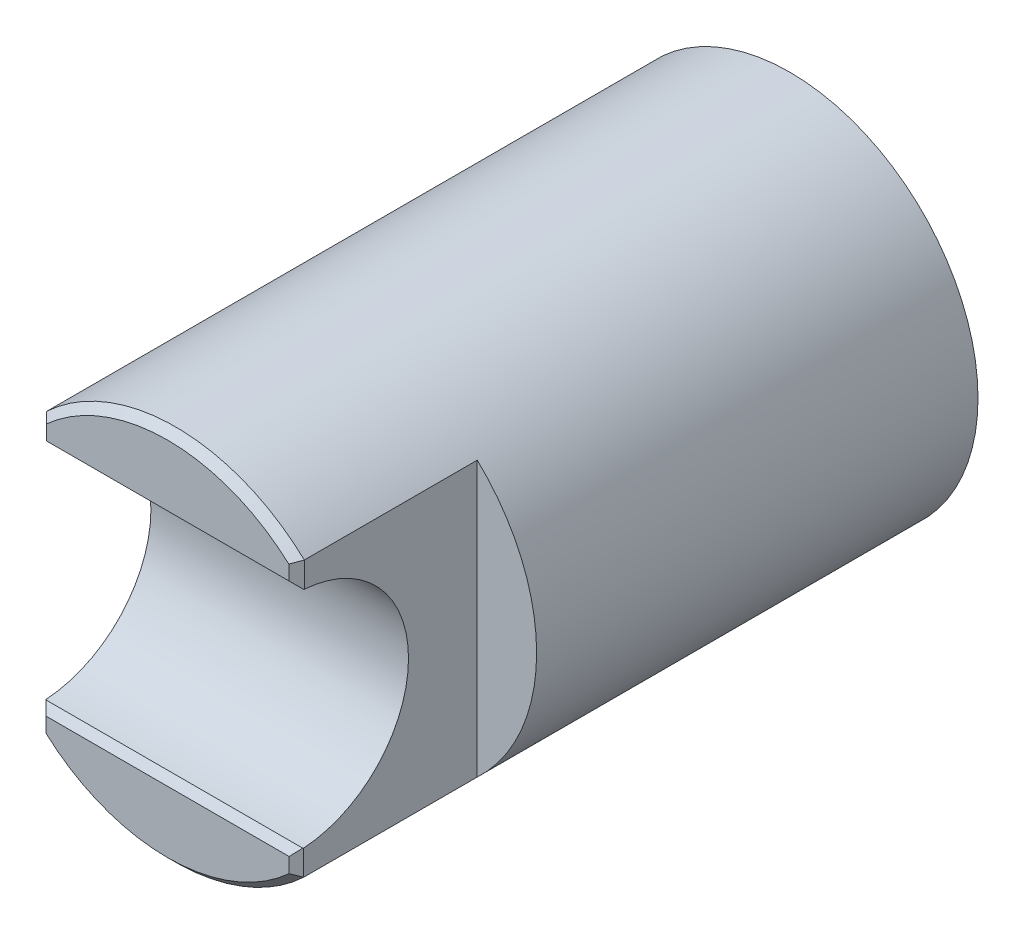
ISO-10303-21;
HEADER;
FILE_DESCRIPTION(('STEP AP214'),'2;1');
FILE_NAME('part.step','',(''),(''),'','','');
FILE_SCHEMA(('AUTOMOTIVE_DESIGN { 1 0 10303 214 1 1 1 1 }'));
ENDSEC;
DATA;
#1=APPLICATION_CONTEXT('core data for automotive mechanical design processes');
#2=APPLICATION_PROTOCOL_DEFINITION('international standard','automotive_design',2000,#1);
#3=PRODUCT_CONTEXT('',#1,'mechanical');
#4=PRODUCT('Part','Part','',(#3));
#5=PRODUCT_RELATED_PRODUCT_CATEGORY('part','',(#4));
#6=PRODUCT_DEFINITION_FORMATION('','',#4);
#7=PRODUCT_DEFINITION_CONTEXT('part definition',#1,'design');
#8=PRODUCT_DEFINITION('design','',#6,#7);
#9=PRODUCT_DEFINITION_SHAPE('','',#8);
#10=(LENGTH_UNIT() NAMED_UNIT(*) SI_UNIT(.MILLI.,.METRE.));
#11=(NAMED_UNIT(*) PLANE_ANGLE_UNIT() SI_UNIT($,.RADIAN.));
#12=(NAMED_UNIT(*) SI_UNIT($,.STERADIAN.) SOLID_ANGLE_UNIT());
#13=UNCERTAINTY_MEASURE_WITH_UNIT(LENGTH_MEASURE(1.E-05),#10,'distance_accuracy_value','');
#14=(GEOMETRIC_REPRESENTATION_CONTEXT(3) GLOBAL_UNCERTAINTY_ASSIGNED_CONTEXT((#13)) GLOBAL_UNIT_ASSIGNED_CONTEXT((#10,
#11,#12)) REPRESENTATION_CONTEXT('',''));
#15=CARTESIAN_POINT('',(0.,0.,0.));
#16=DIRECTION('',(0.,0.,1.));
#17=DIRECTION('',(1.,0.,0.));
#18=AXIS2_PLACEMENT_3D('',#15,#16,#17);
#19=CARTESIAN_POINT('',(0.,0.,-43.));
#20=DIRECTION('',(0.,0.,1.));
#21=DIRECTION('',(1.,0.,0.));
#22=AXIS2_PLACEMENT_3D('',#19,#20,#21);
#23=CYLINDRICAL_SURFACE('',#22,13.005);
#24=CARTESIAN_POINT('',(0.,0.,-43.));
#25=DIRECTION('',(0.,0.,1.));
#26=DIRECTION('',(1.,0.,0.));
#27=AXIS2_PLACEMENT_3D('',#24,#25,#26);
#28=CIRCLE('',#27,13.005);
#29=CARTESIAN_POINT('',(13.005,0.,-43.));
#30=VERTEX_POINT('',#29);
#31=EDGE_CURVE('E138',#30,#30,#28,.T.);
#32=ORIENTED_EDGE('',*,*,#31,.T.);
#33=EDGE_LOOP('',(#32));
#34=FACE_BOUND('',#33,.T.);
#35=DIRECTION('',(0.,0.,1.));
#36=VECTOR('',#35,1.);
#37=CARTESIAN_POINT('',(-8.9,9.48261699110536,-43.));
#38=LINE('',#37,#36);
#39=CARTESIAN_POINT('',(-8.9,9.48261699110536,-0.551886359212057));
#40=VERTEX_POINT('',#39);
#41=CARTESIAN_POINT('',(-8.9,9.48261699110536,-12.5));
#42=VERTEX_POINT('',#41);
#43=EDGE_CURVE('E166',#40,#42,#38,.F.);
#44=ORIENTED_EDGE('',*,*,#43,.F.);
#45=CARTESIAN_POINT('',(0.,0.,-0.551886359212057));
#46=DIRECTION('',(0.,0.,1.));
#47=DIRECTION('',(1.,0.,0.));
#48=AXIS2_PLACEMENT_3D('',#45,#46,#47);
#49=CIRCLE('',#48,13.005);
#50=CARTESIAN_POINT('',(8.9,9.48261699110536,-0.551886359212057));
#51=VERTEX_POINT('',#50);
#52=EDGE_CURVE('E201',#40,#51,#49,.F.);
#53=ORIENTED_EDGE('',*,*,#52,.T.);
#54=DIRECTION('',(0.,0.,1.));
#55=VECTOR('',#54,1.);
#56=CARTESIAN_POINT('',(8.9,9.48261699110536,-43.));
#57=LINE('',#56,#55);
#58=CARTESIAN_POINT('',(8.9,9.48261699110536,-12.5));
#59=VERTEX_POINT('',#58);
#60=EDGE_CURVE('E139',#59,#51,#57,.T.);
#61=ORIENTED_EDGE('',*,*,#60,.F.);
#62=CARTESIAN_POINT('',(0.,0.,-12.5));
#63=DIRECTION('',(0.,0.,1.));
#64=DIRECTION('',(1.,0.,0.));
#65=AXIS2_PLACEMENT_3D('',#62,#63,#64);
#66=CIRCLE('',#65,13.005);
#67=CARTESIAN_POINT('',(8.9,-9.48261699110536,-12.5));
#68=VERTEX_POINT('',#67);
#69=EDGE_CURVE('E134',#68,#59,#66,.T.);
#70=ORIENTED_EDGE('',*,*,#69,.F.);
#71=DIRECTION('',(0.,0.,1.));
#72=VECTOR('',#71,1.);
#73=CARTESIAN_POINT('',(8.9,-9.48261699110536,-43.));
#74=LINE('',#73,#72);
#75=CARTESIAN_POINT('',(8.9,-9.48261699110536,-0.500000000000007));
#76=VERTEX_POINT('',#75);
#77=EDGE_CURVE('E142',#68,#76,#74,.T.);
#78=ORIENTED_EDGE('',*,*,#77,.T.);
#79=CARTESIAN_POINT('',(0.,0.,-0.500000000000007));
#80=DIRECTION('',(0.,0.,1.));
#81=DIRECTION('',(1.,0.,0.));
#82=AXIS2_PLACEMENT_3D('',#79,#80,#81);
#83=CIRCLE('',#82,13.005);
#84=CARTESIAN_POINT('',(-8.9,-9.48261699110536,-0.500000000000007));
#85=VERTEX_POINT('',#84);
#86=EDGE_CURVE('E199',#76,#85,#83,.F.);
#87=ORIENTED_EDGE('',*,*,#86,.T.);
#88=DIRECTION('',(0.,0.,1.));
#89=VECTOR('',#88,1.);
#90=CARTESIAN_POINT('',(-8.9,-9.48261699110536,-43.));
#91=LINE('',#90,#89);
#92=CARTESIAN_POINT('',(-8.9,-9.48261699110536,-12.5));
#93=VERTEX_POINT('',#92);
#94=EDGE_CURVE('E157',#85,#93,#91,.F.);
#95=ORIENTED_EDGE('',*,*,#94,.T.);
#96=CARTESIAN_POINT('',(0.,0.,-12.5));
#97=DIRECTION('',(0.,0.,1.));
#98=DIRECTION('',(1.,0.,0.));
#99=AXIS2_PLACEMENT_3D('',#96,#97,#98);
#100=CIRCLE('',#99,13.005);
#101=EDGE_CURVE('E163',#42,#93,#100,.T.);
#102=ORIENTED_EDGE('',*,*,#101,.F.);
#103=EDGE_LOOP('',(#44,#53,#61,#70,#78,#87,#95,#102));
#104=FACE_BOUND('',#103,.T.);
#105=ADVANCED_FACE('F35',(#34,#104),#23,.T.);
#106=CARTESIAN_POINT('',(0.,0.,0.));
#107=DIRECTION('',(0.,0.,1.));
#108=DIRECTION('',(1.,0.,0.));
#109=AXIS2_PLACEMENT_3D('',#106,#107,#108);
#110=PLANE('',#109);
#111=CARTESIAN_POINT('',(0.,0.,0.));
#112=DIRECTION('',(0.,0.,1.));
#113=DIRECTION('',(1.,0.,0.));
#114=AXIS2_PLACEMENT_3D('',#111,#112,#113);
#115=CIRCLE('',#114,12.486561298922);
#116=CARTESIAN_POINT('',(8.381561298922,9.25546558872916,0.));
#117=VERTEX_POINT('',#116);
#118=CARTESIAN_POINT('',(-8.381561298922,9.25546558872916,0.));
#119=VERTEX_POINT('',#118);
#120=EDGE_CURVE('E176',#117,#119,#115,.T.);
#121=ORIENTED_EDGE('',*,*,#120,.T.);
#122=DIRECTION('',(0.,-1.,0.));
#123=VECTOR('',#122,1.);
#124=CARTESIAN_POINT('',(-8.381561298922,0.,0.));
#125=LINE('',#124,#123);
#126=CARTESIAN_POINT('',(-8.381561298922,8.25,0.));
#127=VERTEX_POINT('',#126);
#128=EDGE_CURVE('E178',#119,#127,#125,.T.);
#129=ORIENTED_EDGE('',*,*,#128,.T.);
#130=DIRECTION('',(1.,0.,0.));
#131=VECTOR('',#130,1.);
#132=CARTESIAN_POINT('',(0.,8.25,0.));
#133=LINE('',#132,#131);
#134=CARTESIAN_POINT('',(8.381561298922,8.25,0.));
#135=VERTEX_POINT('',#134);
#136=EDGE_CURVE('E172',#127,#135,#133,.T.);
#137=ORIENTED_EDGE('',*,*,#136,.T.);
#138=DIRECTION('',(0.,1.,0.));
#139=VECTOR('',#138,1.);
#140=CARTESIAN_POINT('',(8.381561298922,0.,0.));
#141=LINE('',#140,#139);
#142=EDGE_CURVE('E174',#135,#117,#141,.T.);
#143=ORIENTED_EDGE('',*,*,#142,.T.);
#144=EDGE_LOOP('',(#121,#129,#137,#143));
#145=FACE_BOUND('',#144,.T.);
#146=ADVANCED_FACE('F286',(#145),#110,.T.);
#147=DIRECTION('',(-1.,0.,0.));
#148=VECTOR('',#147,1.);
#149=CARTESIAN_POINT('',(0.,-8.23483454600031,0.));
#150=LINE('',#149,#148);
#151=CARTESIAN_POINT('',(8.4,-8.23483454600031,0.));
#152=VERTEX_POINT('',#151);
#153=CARTESIAN_POINT('',(-8.4,-8.23483454600031,0.));
#154=VERTEX_POINT('',#153);
#155=EDGE_CURVE('E51',#152,#154,#150,.T.);
#156=ORIENTED_EDGE('',*,*,#155,.T.);
#157=DIRECTION('',(0.,-1.,0.));
#158=VECTOR('',#157,1.);
#159=CARTESIAN_POINT('',(-8.4,0.,0.));
#160=LINE('',#159,#158);
#161=CARTESIAN_POINT('',(-8.4,-9.2636399433484,0.));
#162=VERTEX_POINT('',#161);
#163=EDGE_CURVE('E11',#154,#162,#160,.T.);
#164=ORIENTED_EDGE('',*,*,#163,.T.);
#165=CARTESIAN_POINT('',(0.,0.,0.));
#166=DIRECTION('',(0.,0.,1.));
#167=DIRECTION('',(1.,0.,0.));
#168=AXIS2_PLACEMENT_3D('',#165,#166,#167);
#169=CIRCLE('',#168,12.505);
#170=CARTESIAN_POINT('',(8.4,-9.2636399433484,0.));
#171=VERTEX_POINT('',#170);
#172=EDGE_CURVE('E206',#162,#171,#169,.T.);
#173=ORIENTED_EDGE('',*,*,#172,.T.);
#174=DIRECTION('',(0.,1.,0.));
#175=VECTOR('',#174,1.);
#176=CARTESIAN_POINT('',(8.4,0.,0.));
#177=LINE('',#176,#175);
#178=EDGE_CURVE('E62',#171,#152,#177,.T.);
#179=ORIENTED_EDGE('',*,*,#178,.T.);
#180=EDGE_LOOP('',(#156,#164,#173,#179));
#181=FACE_BOUND('',#180,.T.);
#182=ADVANCED_FACE('F291',(#181),#110,.T.);
#183=CARTESIAN_POINT('',(13.006,0.,0.));
#184=DIRECTION('',(-1.,0.,0.));
#185=DIRECTION('',(0.,0.,1.));
#186=AXIS2_PLACEMENT_3D('',#183,#184,#185);
#187=CYLINDRICAL_SURFACE('',#186,7.75);
#188=DIRECTION('',(-1.,0.,0.));
#189=VECTOR('',#188,1.);
#190=CARTESIAN_POINT('',(13.006,7.73271742241545,-0.517282577584549));
#191=LINE('',#190,#189);
#192=CARTESIAN_POINT('',(8.867493417259,7.73271742241545,-0.517282577584549));
#193=VERTEX_POINT('',#192);
#194=CARTESIAN_POINT('',(-8.86749341725901,7.73271742241545,-0.517282577584549));
#195=VERTEX_POINT('',#194);
#196=EDGE_CURVE('E187',#193,#195,#191,.T.);
#197=ORIENTED_EDGE('',*,*,#196,.T.);
#198=CARTESIAN_POINT('',(-8.381561298922,0.,0.));
#199=DIRECTION('',(0.728848072093986,0.,-0.684675461664049));
#200=DIRECTION('',(-0.684675461664049,0.,-0.728848072093986));
#201=AXIS2_PLACEMENT_3D('',#198,#199,#200);
#202=ELLIPSE('',#201,10.6332173970553,7.75);
#203=CARTESIAN_POINT('',(-8.9,7.73032479566775,-0.55188635921206));
#204=VERTEX_POINT('',#203);
#205=EDGE_CURVE('E191',#195,#204,#202,.F.);
#206=ORIENTED_EDGE('',*,*,#205,.T.);
#207=CARTESIAN_POINT('',(-8.9,0.,0.));
#208=DIRECTION('',(-1.,0.,0.));
#209=DIRECTION('',(0.,0.,1.));
#210=AXIS2_PLACEMENT_3D('',#207,#208,#209);
#211=CIRCLE('',#210,7.75);
#212=CARTESIAN_POINT('',(-8.9,-7.73385414912901,-0.500000000000009));
#213=VERTEX_POINT('',#212);
#214=EDGE_CURVE('E159',#213,#204,#211,.F.);
#215=ORIENTED_EDGE('',*,*,#214,.F.);
#216=CARTESIAN_POINT('',(-8.4,0.,0.));
#217=DIRECTION('',(0.70710678118655,0.,-0.707106781186545));
#218=DIRECTION('',(-0.707106781186545,0.,-0.70710678118655));
#219=AXIS2_PLACEMENT_3D('',#216,#217,#218);
#220=ELLIPSE('',#219,10.9601551083914,7.75);
#221=CARTESIAN_POINT('',(-8.86969696969697,-7.73575366442453,-0.469696969696978));
#222=VERTEX_POINT('',#221);
#223=EDGE_CURVE('E185',#213,#222,#220,.F.);
#224=ORIENTED_EDGE('',*,*,#223,.T.);
#225=DIRECTION('',(-1.,0.,0.));
#226=VECTOR('',#225,1.);
#227=CARTESIAN_POINT('',(13.006,-7.73575366442453,-0.469696969696978));
#228=LINE('',#227,#226);
#229=CARTESIAN_POINT('',(8.86969696969697,-7.73575366442453,-0.469696969696978));
#230=VERTEX_POINT('',#229);
#231=EDGE_CURVE('E183',#222,#230,#228,.F.);
#232=ORIENTED_EDGE('',*,*,#231,.T.);
#233=CARTESIAN_POINT('',(8.4,0.,0.));
#234=DIRECTION('',(-0.70710678118655,0.,-0.707106781186545));
#235=DIRECTION('',(-0.707106781186545,0.,0.70710678118655));
#236=AXIS2_PLACEMENT_3D('',#233,#234,#235);
#237=ELLIPSE('',#236,10.9601551083914,7.75);
#238=CARTESIAN_POINT('',(8.9,-7.73385414912901,-0.500000000000009));
#239=VERTEX_POINT('',#238);
#240=EDGE_CURVE('E181',#230,#239,#237,.F.);
#241=ORIENTED_EDGE('',*,*,#240,.T.);
#242=CARTESIAN_POINT('',(8.9,0.,0.));
#243=DIRECTION('',(1.,0.,0.));
#244=DIRECTION('',(0.,0.,-1.));
#245=AXIS2_PLACEMENT_3D('',#242,#243,#244);
#246=CIRCLE('',#245,7.75);
#247=CARTESIAN_POINT('',(8.9,7.73032479566775,-0.55188635921206));
#248=VERTEX_POINT('',#247);
#249=EDGE_CURVE('E149',#248,#239,#246,.F.);
#250=ORIENTED_EDGE('',*,*,#249,.F.);
#251=CARTESIAN_POINT('',(8.381561298922,0.,0.));
#252=DIRECTION('',(-0.728848072093986,0.,-0.684675461664049));
#253=DIRECTION('',(-0.684675461664049,0.,0.728848072093986));
#254=AXIS2_PLACEMENT_3D('',#251,#252,#253);
#255=ELLIPSE('',#254,10.6332173970553,7.75);
#256=EDGE_CURVE('E189',#248,#193,#255,.F.);
#257=ORIENTED_EDGE('',*,*,#256,.T.);
#258=EDGE_LOOP('',(#197,#206,#215,#224,#232,#241,#250,#257));
#259=FACE_BOUND('',#258,.T.);
#260=ADVANCED_FACE('F299',(#259),#187,.F.);
#261=CARTESIAN_POINT('',(0.,0.,-43.));
#262=DIRECTION('',(0.,0.,1.));
#263=DIRECTION('',(1.,0.,0.));
#264=AXIS2_PLACEMENT_3D('',#261,#262,#263);
#265=PLANE('',#264);
#266=ORIENTED_EDGE('',*,*,#31,.F.);
#267=EDGE_LOOP('',(#266));
#268=FACE_BOUND('',#267,.T.);
#269=ADVANCED_FACE('F295',(#268),#265,.F.);
#270=CARTESIAN_POINT('',(-8.9,13.006,-12.5));
#271=DIRECTION('',(0.,0.,1.));
#272=DIRECTION('',(1.,0.,0.));
#273=AXIS2_PLACEMENT_3D('',#270,#271,#272);
#274=PLANE('',#273);
#275=ORIENTED_EDGE('',*,*,#101,.T.);
#276=DIRECTION('',(0.,-1.,0.));
#277=VECTOR('',#276,1.);
#278=CARTESIAN_POINT('',(-8.9,13.006,-12.5));
#279=LINE('',#278,#277);
#280=EDGE_CURVE('E150',#42,#93,#279,.T.);
#281=ORIENTED_EDGE('',*,*,#280,.F.);
#282=EDGE_LOOP('',(#275,#281));
#283=FACE_BOUND('',#282,.T.);
#284=ADVANCED_FACE('F298',(#283),#274,.T.);
#285=CARTESIAN_POINT('',(-8.9,13.006,0.));
#286=DIRECTION('',(-1.,0.,0.));
#287=DIRECTION('',(0.,0.,1.));
#288=AXIS2_PLACEMENT_3D('',#285,#286,#287);
#289=PLANE('',#288);
#290=ORIENTED_EDGE('',*,*,#214,.T.);
#291=DIRECTION('',(0.,1.,0.));
#292=VECTOR('',#291,1.);
#293=CARTESIAN_POINT('',(-8.9,13.006,-0.55188635921206));
#294=LINE('',#293,#292);
#295=EDGE_CURVE('E196',#204,#40,#294,.T.);
#296=ORIENTED_EDGE('',*,*,#295,.T.);
#297=ORIENTED_EDGE('',*,*,#43,.T.);
#298=ORIENTED_EDGE('',*,*,#280,.T.);
#299=ORIENTED_EDGE('',*,*,#94,.F.);
#300=DIRECTION('',(0.,1.,0.));
#301=VECTOR('',#300,1.);
#302=CARTESIAN_POINT('',(-8.9,13.006,-0.500000000000009));
#303=LINE('',#302,#301);
#304=EDGE_CURVE('E193',#85,#213,#303,.T.);
#305=ORIENTED_EDGE('',*,*,#304,.T.);
#306=EDGE_LOOP('',(#290,#296,#297,#298,#299,#305));
#307=FACE_BOUND('',#306,.T.);
#308=ADVANCED_FACE('F304',(#307),#289,.T.);
#309=CARTESIAN_POINT('',(8.9,13.006,-12.5));
#310=DIRECTION('',(0.,0.,1.));
#311=DIRECTION('',(1.,0.,0.));
#312=AXIS2_PLACEMENT_3D('',#309,#310,#311);
#313=PLANE('',#312);
#314=ORIENTED_EDGE('',*,*,#69,.T.);
#315=DIRECTION('',(0.,-1.,0.));
#316=VECTOR('',#315,1.);
#317=CARTESIAN_POINT('',(8.9,13.006,-12.5));
#318=LINE('',#317,#316);
#319=EDGE_CURVE('E130',#59,#68,#318,.T.);
#320=ORIENTED_EDGE('',*,*,#319,.T.);
#321=EDGE_LOOP('',(#314,#320));
#322=FACE_BOUND('',#321,.T.);
#323=ADVANCED_FACE('F132',(#322),#313,.T.);
#324=CARTESIAN_POINT('',(8.9,13.006,0.));
#325=DIRECTION('',(1.,0.,0.));
#326=DIRECTION('',(0.,0.,-1.));
#327=AXIS2_PLACEMENT_3D('',#324,#325,#326);
#328=PLANE('',#327);
#329=ORIENTED_EDGE('',*,*,#60,.T.);
#330=DIRECTION('',(0.,-1.,0.));
#331=VECTOR('',#330,1.);
#332=CARTESIAN_POINT('',(8.9,13.006,-0.55188635921206));
#333=LINE('',#332,#331);
#334=EDGE_CURVE('E204',#51,#248,#333,.T.);
#335=ORIENTED_EDGE('',*,*,#334,.T.);
#336=ORIENTED_EDGE('',*,*,#249,.T.);
#337=DIRECTION('',(0.,-1.,0.));
#338=VECTOR('',#337,1.);
#339=CARTESIAN_POINT('',(8.9,13.006,-0.500000000000009));
#340=LINE('',#339,#338);
#341=EDGE_CURVE('E146',#239,#76,#340,.T.);
#342=ORIENTED_EDGE('',*,*,#341,.T.);
#343=ORIENTED_EDGE('',*,*,#77,.F.);
#344=ORIENTED_EDGE('',*,*,#319,.F.);
#345=EDGE_LOOP('',(#329,#335,#336,#342,#343,#344));
#346=FACE_BOUND('',#345,.T.);
#347=ADVANCED_FACE('F143',(#346),#328,.T.);
#348=CARTESIAN_POINT('',(8.9,13.006,-0.55188635921206));
#349=DIRECTION('',(-0.728848072093986,0.,-0.684675461664049));
#350=DIRECTION('',(0.,-1.,0.));
#351=AXIS2_PLACEMENT_3D('',#348,#349,#350);
#352=PLANE('',#351);
#353=ORIENTED_EDGE('',*,*,#256,.F.);
#354=ORIENTED_EDGE('',*,*,#334,.F.);
#355=CARTESIAN_POINT('',(8.9,9.48261699110536,-0.551886359212059));
#356=CARTESIAN_POINT('',(8.81350707682121,9.44517946055196,-0.459813247441094));
#357=CARTESIAN_POINT('',(8.72705739258465,9.40753141282714,-0.367786164221531));
#358=CARTESIAN_POINT('',(8.55424449221553,9.3318142787494,-0.183824044473757));
#359=CARTESIAN_POINT('',(8.46788127609276,9.29374519234882,-0.0918890079559675));
#360=CARTESIAN_POINT('',(8.381561298922,9.25546558872917,0.));
#361=B_SPLINE_CURVE_WITH_KNOTS('',3,(#355,#356,#357,#358,#359,#360),.UNSPECIFIED.,.F.,.F.,(4,2,
4),(0.,0.395271004542359,0.790542053825931),.UNSPECIFIED.);
#362=EDGE_CURVE('E160',#117,#51,#361,.F.);
#363=ORIENTED_EDGE('',*,*,#362,.F.);
#364=ORIENTED_EDGE('',*,*,#142,.F.);
#365=DIRECTION('',(-0.553306836142433,0.58900405137743,0.589004051377428));
#366=VECTOR('',#365,1.);
#367=CARTESIAN_POINT('',(10.1344908132495,6.38397825894172,-1.86602174105828));
#368=LINE('',#367,#366);
#369=EDGE_CURVE('E220',#193,#135,#368,.T.);
#370=ORIENTED_EDGE('',*,*,#369,.F.);
#371=EDGE_LOOP('',(#353,#354,#363,#364,#370));
#372=FACE_BOUND('',#371,.T.);
#373=ADVANCED_FACE('F242',(#372),#352,.F.);
#374=CARTESIAN_POINT('',(0.,0.,0.));
#375=DIRECTION('',(0.,0.,-1.));
#376=DIRECTION('',(-1.,0.,0.));
#377=AXIS2_PLACEMENT_3D('',#374,#375,#376);
#378=CONICAL_SURFACE('',#377,12.486561298922,0.754158329967184);
#379=ORIENTED_EDGE('',*,*,#362,.T.);
#380=ORIENTED_EDGE('',*,*,#52,.F.);
#381=CARTESIAN_POINT('',(-8.9,9.48261699110536,-0.551886359212059));
#382=CARTESIAN_POINT('',(-8.81350707682121,9.44517946055196,-0.459813247441094));
#383=CARTESIAN_POINT('',(-8.72705739258465,9.40753141282714,-0.367786164221531));
#384=CARTESIAN_POINT('',(-8.55424449221553,9.3318142787494,-0.183824044473757));
#385=CARTESIAN_POINT('',(-8.46788127609276,9.29374519234882,-0.0918890079559676));
#386=CARTESIAN_POINT('',(-8.381561298922,9.25546558872917,0.));
#387=B_SPLINE_CURVE_WITH_KNOTS('',3,(#381,#382,#383,#384,#385,#386),.UNSPECIFIED.,.F.,.F.,(4,2,
4),(0.,0.395271004542359,0.790542053825931),.UNSPECIFIED.);
#388=EDGE_CURVE('E212',#119,#40,#387,.F.);
#389=ORIENTED_EDGE('',*,*,#388,.F.);
#390=ORIENTED_EDGE('',*,*,#120,.F.);
#391=EDGE_LOOP('',(#379,#380,#389,#390));
#392=FACE_BOUND('',#391,.T.);
#393=ADVANCED_FACE('F223',(#392),#378,.T.);
#394=CARTESIAN_POINT('',(13.006,7.73271742241545,-0.517282577584549));
#395=DIRECTION('',(0.,0.707106781186546,-0.707106781186549));
#396=DIRECTION('',(-1.,0.,0.));
#397=AXIS2_PLACEMENT_3D('',#394,#395,#396);
#398=PLANE('',#397);
#399=ORIENTED_EDGE('',*,*,#369,.T.);
#400=ORIENTED_EDGE('',*,*,#136,.F.);
#401=DIRECTION('',(-0.553306836142433,-0.58900405137743,-0.589004051377428));
#402=VECTOR('',#401,1.);
#403=CARTESIAN_POINT('',(-2.17095720381972,14.8612882302702,6.61128823027015));
#404=LINE('',#403,#402);
#405=EDGE_CURVE('E210',#195,#127,#404,.F.);
#406=ORIENTED_EDGE('',*,*,#405,.F.);
#407=ORIENTED_EDGE('',*,*,#196,.F.);
#408=EDGE_LOOP('',(#399,#400,#406,#407));
#409=FACE_BOUND('',#408,.T.);
#410=ADVANCED_FACE('F234',(#409),#398,.F.);
#411=CARTESIAN_POINT('',(-8.381561298922,0.,0.));
#412=DIRECTION('',(0.728848072093986,0.,-0.684675461664049));
#413=DIRECTION('',(0.,-1.,0.));
#414=AXIS2_PLACEMENT_3D('',#411,#412,#413);
#415=PLANE('',#414);
#416=ORIENTED_EDGE('',*,*,#388,.T.);
#417=ORIENTED_EDGE('',*,*,#295,.F.);
#418=ORIENTED_EDGE('',*,*,#205,.F.);
#419=ORIENTED_EDGE('',*,*,#405,.T.);
#420=ORIENTED_EDGE('',*,*,#128,.F.);
#421=EDGE_LOOP('',(#416,#417,#418,#419,#420));
#422=FACE_BOUND('',#421,.T.);
#423=ADVANCED_FACE('F227',(#422),#415,.F.);
#424=CARTESIAN_POINT('',(8.4,0.,0.));
#425=DIRECTION('',(-0.70710678118655,0.,-0.707106781186545));
#426=DIRECTION('',(0.,1.,0.));
#427=AXIS2_PLACEMENT_3D('',#424,#425,#426);
#428=PLANE('',#427);
#429=DIRECTION('',(0.565320819416708,0.600686892039471,-0.565320819416712));
#430=VECTOR('',#429,1.);
#431=CARTESIAN_POINT('',(11.1963917525773,-5.2635024933198,-2.79639175257733));
#432=LINE('',#431,#430);
#433=EDGE_CURVE('E266',#152,#230,#432,.T.);
#434=ORIENTED_EDGE('',*,*,#433,.F.);
#435=ORIENTED_EDGE('',*,*,#178,.F.);
#436=CARTESIAN_POINT('',(8.9,-9.48261699110536,-0.500000000000008));
#437=CARTESIAN_POINT('',(8.81658148948754,-9.44650981640321,-0.416581489487548));
#438=CARTESIAN_POINT('',(8.73320556978692,-9.4102081427237,-0.333205569786931));
#439=CARTESIAN_POINT('',(8.56653890311116,-9.33721579351292,-0.166538903111166));
#440=CARTESIAN_POINT('',(8.48324815614511,-9.30052511794011,-0.0832481561451139));
#441=CARTESIAN_POINT('',(8.4,-9.2636399433484,0.));
#442=B_SPLINE_CURVE_WITH_KNOTS('',3,(#436,#437,#438,#439,#440,#441),.UNSPECIFIED.,.F.,.F.,(4,2,
4),(0.,0.370119028630024,0.740238096780844),.UNSPECIFIED.);
#443=EDGE_CURVE('E41',#76,#171,#442,.T.);
#444=ORIENTED_EDGE('',*,*,#443,.F.);
#445=ORIENTED_EDGE('',*,*,#341,.F.);
#446=ORIENTED_EDGE('',*,*,#240,.F.);
#447=EDGE_LOOP('',(#434,#435,#444,#445,#446));
#448=FACE_BOUND('',#447,.T.);
#449=ADVANCED_FACE('F38',(#448),#428,.F.);
#450=CARTESIAN_POINT('',(0.,0.,0.));
#451=DIRECTION('',(0.,0.,-1.));
#452=DIRECTION('',(-1.,0.,0.));
#453=AXIS2_PLACEMENT_3D('',#450,#451,#452);
#454=CONICAL_SURFACE('',#453,12.505,0.785398163397447);
#455=ORIENTED_EDGE('',*,*,#443,.T.);
#456=ORIENTED_EDGE('',*,*,#172,.F.);
#457=CARTESIAN_POINT('',(-8.4,-9.2636399433484,0.));
#458=CARTESIAN_POINT('',(-8.48324815614511,-9.30052511794011,-0.0832481561451138));
#459=CARTESIAN_POINT('',(-8.56653890311116,-9.33721579351292,-0.166538903111166));
#460=CARTESIAN_POINT('',(-8.73320556978692,-9.4102081427237,-0.333205569786931));
#461=CARTESIAN_POINT('',(-8.81658148948754,-9.44650981640322,-0.416581489487548));
#462=CARTESIAN_POINT('',(-8.9,-9.48261699110536,-0.500000000000007));
#463=B_SPLINE_CURVE_WITH_KNOTS('',3,(#457,#458,#459,#460,#461,#462),.UNSPECIFIED.,.F.,.F.,(4,2,
4),(0.,0.37011906815082,0.740238096780844),.UNSPECIFIED.);
#464=EDGE_CURVE('E261',#85,#162,#463,.F.);
#465=ORIENTED_EDGE('',*,*,#464,.F.);
#466=ORIENTED_EDGE('',*,*,#86,.F.);
#467=EDGE_LOOP('',(#455,#456,#465,#466));
#468=FACE_BOUND('',#467,.T.);
#469=ADVANCED_FACE('F249',(#468),#454,.T.);
#470=CARTESIAN_POINT('',(13.006,-7.73575366442453,-0.469696969696978));
#471=DIRECTION('',(0.,0.685344416842345,0.728219081254416));
#472=DIRECTION('',(-1.,0.,0.));
#473=AXIS2_PLACEMENT_3D('',#470,#471,#472);
#474=PLANE('',#473);
#475=ORIENTED_EDGE('',*,*,#433,.T.);
#476=ORIENTED_EDGE('',*,*,#231,.F.);
#477=DIRECTION('',(-0.565320819416708,0.600686892039471,-0.565320819416712));
#478=VECTOR('',#477,1.);
#479=CARTESIAN_POINT('',(-1.87849484536084,-15.1643204736573,6.5215051546392));
#480=LINE('',#479,#478);
#481=EDGE_CURVE('E258',#154,#222,#480,.T.);
#482=ORIENTED_EDGE('',*,*,#481,.F.);
#483=ORIENTED_EDGE('',*,*,#155,.F.);
#484=EDGE_LOOP('',(#475,#476,#482,#483));
#485=FACE_BOUND('',#484,.T.);
#486=ADVANCED_FACE('F274',(#485),#474,.T.);
#487=CARTESIAN_POINT('',(-8.9,13.006,-0.500000000000009));
#488=DIRECTION('',(0.70710678118655,0.,-0.707106781186545));
#489=DIRECTION('',(0.,1.,0.));
#490=AXIS2_PLACEMENT_3D('',#487,#488,#489);
#491=PLANE('',#490);
#492=ORIENTED_EDGE('',*,*,#464,.T.);
#493=ORIENTED_EDGE('',*,*,#163,.F.);
#494=ORIENTED_EDGE('',*,*,#481,.T.);
#495=ORIENTED_EDGE('',*,*,#223,.F.);
#496=ORIENTED_EDGE('',*,*,#304,.F.);
#497=EDGE_LOOP('',(#492,#493,#494,#495,#496));
#498=FACE_BOUND('',#497,.T.);
#499=ADVANCED_FACE('F268',(#498),#491,.F.);
#500=CLOSED_SHELL('',(#105,#146,#182,#260,#269,#284,#308,#323,#347,#373,#393,#410,#423,#449,
#469,#486,#499));
#501=MANIFOLD_SOLID_BREP('B2',#500);
#502=ADVANCED_BREP_SHAPE_REPRESENTATION('',(#18,#501),#14);
#503=SHAPE_DEFINITION_REPRESENTATION(#9,#502);
ENDSEC;
END-ISO-10303-21;
